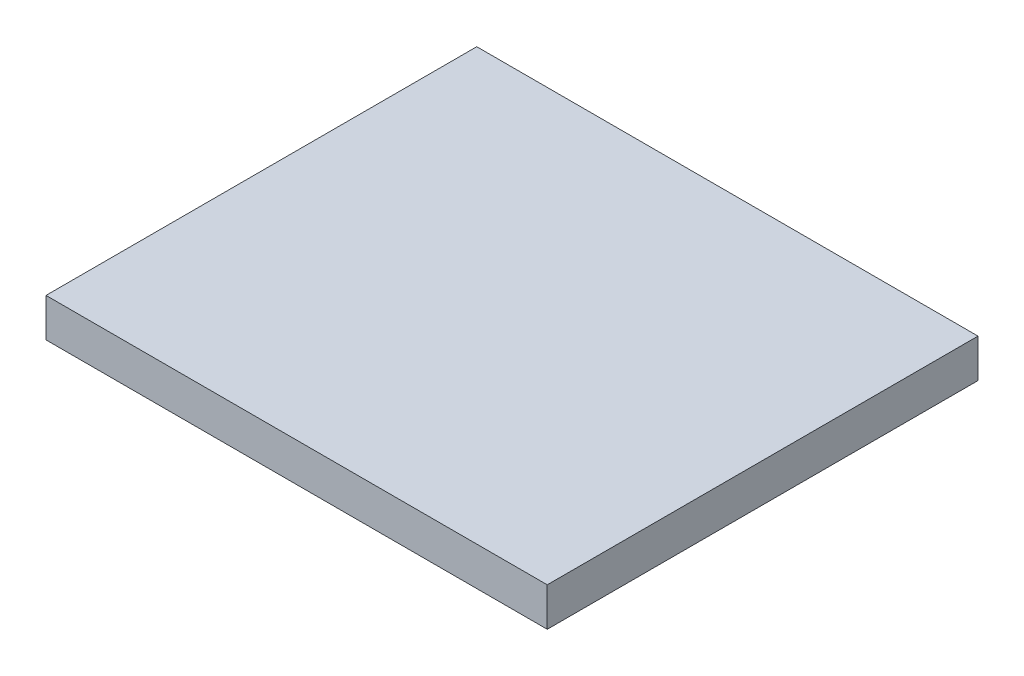
ISO-10303-21;
HEADER;
FILE_DESCRIPTION(('STEP AP214'),'2;1');
FILE_NAME('part.step','',(''),(''),'','','');
FILE_SCHEMA(('AUTOMOTIVE_DESIGN { 1 0 10303 214 1 1 1 1 }'));
ENDSEC;
DATA;
#1=APPLICATION_CONTEXT('core data for automotive mechanical design processes');
#2=APPLICATION_PROTOCOL_DEFINITION('international standard','automotive_design',2000,#1);
#3=PRODUCT_CONTEXT('',#1,'mechanical');
#4=PRODUCT('Part','Part','',(#3));
#5=PRODUCT_RELATED_PRODUCT_CATEGORY('part','',(#4));
#6=PRODUCT_DEFINITION_FORMATION('','',#4);
#7=PRODUCT_DEFINITION_CONTEXT('part definition',#1,'design');
#8=PRODUCT_DEFINITION('design','',#6,#7);
#9=PRODUCT_DEFINITION_SHAPE('','',#8);
#10=(LENGTH_UNIT() NAMED_UNIT(*) SI_UNIT(.MILLI.,.METRE.));
#11=(NAMED_UNIT(*) PLANE_ANGLE_UNIT() SI_UNIT($,.RADIAN.));
#12=(NAMED_UNIT(*) SI_UNIT($,.STERADIAN.) SOLID_ANGLE_UNIT());
#13=UNCERTAINTY_MEASURE_WITH_UNIT(LENGTH_MEASURE(1.E-05),#10,'distance_accuracy_value','');
#14=(GEOMETRIC_REPRESENTATION_CONTEXT(3) GLOBAL_UNCERTAINTY_ASSIGNED_CONTEXT((#13)) GLOBAL_UNIT_ASSIGNED_CONTEXT((#10,
#11,#12)) REPRESENTATION_CONTEXT('',''));
#15=CARTESIAN_POINT('',(0.,0.,0.));
#16=DIRECTION('',(0.,0.,1.));
#17=DIRECTION('',(1.,0.,0.));
#18=AXIS2_PLACEMENT_3D('',#15,#16,#17);
#19=CARTESIAN_POINT('',(0.,5.,0.));
#20=DIRECTION('',(1.,0.,0.));
#21=DIRECTION('',(0.,0.,-1.));
#22=AXIS2_PLACEMENT_3D('',#19,#20,#21);
#23=PLANE('',#22);
#24=DIRECTION('',(0.,0.,1.));
#25=VECTOR('',#24,1.);
#26=CARTESIAN_POINT('',(0.,0.,0.));
#27=LINE('',#26,#25);
#28=CARTESIAN_POINT('',(0.,0.,-55.88));
#29=VERTEX_POINT('',#28);
#30=CARTESIAN_POINT('',(0.,0.,0.));
#31=VERTEX_POINT('',#30);
#32=EDGE_CURVE('E109',#29,#31,#27,.T.);
#33=ORIENTED_EDGE('',*,*,#32,.T.);
#34=DIRECTION('',(0.,-1.,0.));
#35=VECTOR('',#34,1.);
#36=CARTESIAN_POINT('',(0.,5.,0.));
#37=LINE('',#36,#35);
#38=CARTESIAN_POINT('',(0.,5.,0.));
#39=VERTEX_POINT('',#38);
#40=EDGE_CURVE('E11',#39,#31,#37,.T.);
#41=ORIENTED_EDGE('',*,*,#40,.F.);
#42=DIRECTION('',(0.,0.,1.));
#43=VECTOR('',#42,1.);
#44=CARTESIAN_POINT('',(0.,5.,0.));
#45=LINE('',#44,#43);
#46=CARTESIAN_POINT('',(0.,5.,-55.88));
#47=VERTEX_POINT('',#46);
#48=EDGE_CURVE('E94',#47,#39,#45,.T.);
#49=ORIENTED_EDGE('',*,*,#48,.F.);
#50=DIRECTION('',(0.,-1.,0.));
#51=VECTOR('',#50,1.);
#52=CARTESIAN_POINT('',(0.,5.,-55.88));
#53=LINE('',#52,#51);
#54=EDGE_CURVE('E105',#47,#29,#53,.T.);
#55=ORIENTED_EDGE('',*,*,#54,.T.);
#56=EDGE_LOOP('',(#33,#41,#49,#55));
#57=FACE_BOUND('',#56,.T.);
#58=ADVANCED_FACE('F39',(#57),#23,.F.);
#59=CARTESIAN_POINT('',(0.,5.,0.));
#60=DIRECTION('',(0.,0.,-1.));
#61=DIRECTION('',(-1.,0.,0.));
#62=AXIS2_PLACEMENT_3D('',#59,#60,#61);
#63=PLANE('',#62);
#64=DIRECTION('',(1.,0.,0.));
#65=VECTOR('',#64,1.);
#66=CARTESIAN_POINT('',(0.,0.,0.));
#67=LINE('',#66,#65);
#68=CARTESIAN_POINT('',(65.024,0.,0.));
#69=VERTEX_POINT('',#68);
#70=EDGE_CURVE('E98',#31,#69,#67,.T.);
#71=ORIENTED_EDGE('',*,*,#70,.T.);
#72=DIRECTION('',(0.,-1.,0.));
#73=VECTOR('',#72,1.);
#74=CARTESIAN_POINT('',(65.024,5.,0.));
#75=LINE('',#74,#73);
#76=CARTESIAN_POINT('',(65.024,5.,0.));
#77=VERTEX_POINT('',#76);
#78=EDGE_CURVE('E47',#77,#69,#75,.T.);
#79=ORIENTED_EDGE('',*,*,#78,.F.);
#80=DIRECTION('',(1.,0.,0.));
#81=VECTOR('',#80,1.);
#82=CARTESIAN_POINT('',(0.,5.,0.));
#83=LINE('',#82,#81);
#84=EDGE_CURVE('E89',#39,#77,#83,.T.);
#85=ORIENTED_EDGE('',*,*,#84,.F.);
#86=ORIENTED_EDGE('',*,*,#40,.T.);
#87=EDGE_LOOP('',(#71,#79,#85,#86));
#88=FACE_BOUND('',#87,.T.);
#89=ADVANCED_FACE('F97',(#88),#63,.F.);
#90=CARTESIAN_POINT('',(65.024,5.,0.));
#91=DIRECTION('',(-1.,0.,0.));
#92=DIRECTION('',(0.,0.,1.));
#93=AXIS2_PLACEMENT_3D('',#90,#91,#92);
#94=PLANE('',#93);
#95=DIRECTION('',(0.,0.,-1.));
#96=VECTOR('',#95,1.);
#97=CARTESIAN_POINT('',(65.024,0.,0.));
#98=LINE('',#97,#96);
#99=CARTESIAN_POINT('',(65.024,0.,-55.88));
#100=VERTEX_POINT('',#99);
#101=EDGE_CURVE('E76',#69,#100,#98,.T.);
#102=ORIENTED_EDGE('',*,*,#101,.T.);
#103=DIRECTION('',(0.,-1.,0.));
#104=VECTOR('',#103,1.);
#105=CARTESIAN_POINT('',(65.024,5.,-55.88));
#106=LINE('',#105,#104);
#107=CARTESIAN_POINT('',(65.024,5.,-55.88));
#108=VERTEX_POINT('',#107);
#109=EDGE_CURVE('E99',#108,#100,#106,.T.);
#110=ORIENTED_EDGE('',*,*,#109,.F.);
#111=DIRECTION('',(0.,0.,-1.));
#112=VECTOR('',#111,1.);
#113=CARTESIAN_POINT('',(65.024,5.,0.));
#114=LINE('',#113,#112);
#115=EDGE_CURVE('E92',#77,#108,#114,.T.);
#116=ORIENTED_EDGE('',*,*,#115,.F.);
#117=ORIENTED_EDGE('',*,*,#78,.T.);
#118=EDGE_LOOP('',(#102,#110,#116,#117));
#119=FACE_BOUND('',#118,.T.);
#120=ADVANCED_FACE('F100',(#119),#94,.F.);
#121=CARTESIAN_POINT('',(0.,5.,-55.88));
#122=DIRECTION('',(0.,0.,1.));
#123=DIRECTION('',(1.,0.,0.));
#124=AXIS2_PLACEMENT_3D('',#121,#122,#123);
#125=PLANE('',#124);
#126=DIRECTION('',(-1.,0.,0.));
#127=VECTOR('',#126,1.);
#128=CARTESIAN_POINT('',(0.,0.,-55.88));
#129=LINE('',#128,#127);
#130=EDGE_CURVE('E82',#100,#29,#129,.T.);
#131=ORIENTED_EDGE('',*,*,#130,.T.);
#132=ORIENTED_EDGE('',*,*,#54,.F.);
#133=DIRECTION('',(-1.,0.,0.));
#134=VECTOR('',#133,1.);
#135=CARTESIAN_POINT('',(0.,5.,-55.88));
#136=LINE('',#135,#134);
#137=EDGE_CURVE('E57',#108,#47,#136,.T.);
#138=ORIENTED_EDGE('',*,*,#137,.F.);
#139=ORIENTED_EDGE('',*,*,#109,.T.);
#140=EDGE_LOOP('',(#131,#132,#138,#139));
#141=FACE_BOUND('',#140,.T.);
#142=ADVANCED_FACE('F120',(#141),#125,.F.);
#143=CARTESIAN_POINT('',(0.,5.,0.));
#144=DIRECTION('',(0.,-1.,0.));
#145=DIRECTION('',(0.,0.,-1.));
#146=AXIS2_PLACEMENT_3D('',#143,#144,#145);
#147=PLANE('',#146);
#148=ORIENTED_EDGE('',*,*,#48,.T.);
#149=ORIENTED_EDGE('',*,*,#84,.T.);
#150=ORIENTED_EDGE('',*,*,#115,.T.);
#151=ORIENTED_EDGE('',*,*,#137,.T.);
#152=EDGE_LOOP('',(#148,#149,#150,#151));
#153=FACE_BOUND('',#152,.T.);
#154=ADVANCED_FACE('F90',(#153),#147,.F.);
#155=CARTESIAN_POINT('',(0.,0.,0.));
#156=DIRECTION('',(0.,-1.,0.));
#157=DIRECTION('',(0.,0.,-1.));
#158=AXIS2_PLACEMENT_3D('',#155,#156,#157);
#159=PLANE('',#158);
#160=ORIENTED_EDGE('',*,*,#32,.F.);
#161=ORIENTED_EDGE('',*,*,#130,.F.);
#162=ORIENTED_EDGE('',*,*,#101,.F.);
#163=ORIENTED_EDGE('',*,*,#70,.F.);
#164=EDGE_LOOP('',(#160,#161,#162,#163));
#165=FACE_BOUND('',#164,.T.);
#166=ADVANCED_FACE('F123',(#165),#159,.T.);
#167=CLOSED_SHELL('',(#58,#89,#120,#142,#154,#166));
#168=MANIFOLD_SOLID_BREP('B2',#167);
#169=ADVANCED_BREP_SHAPE_REPRESENTATION('',(#18,#168),#14);
#170=SHAPE_DEFINITION_REPRESENTATION(#9,#169);
ENDSEC;
END-ISO-10303-21;
